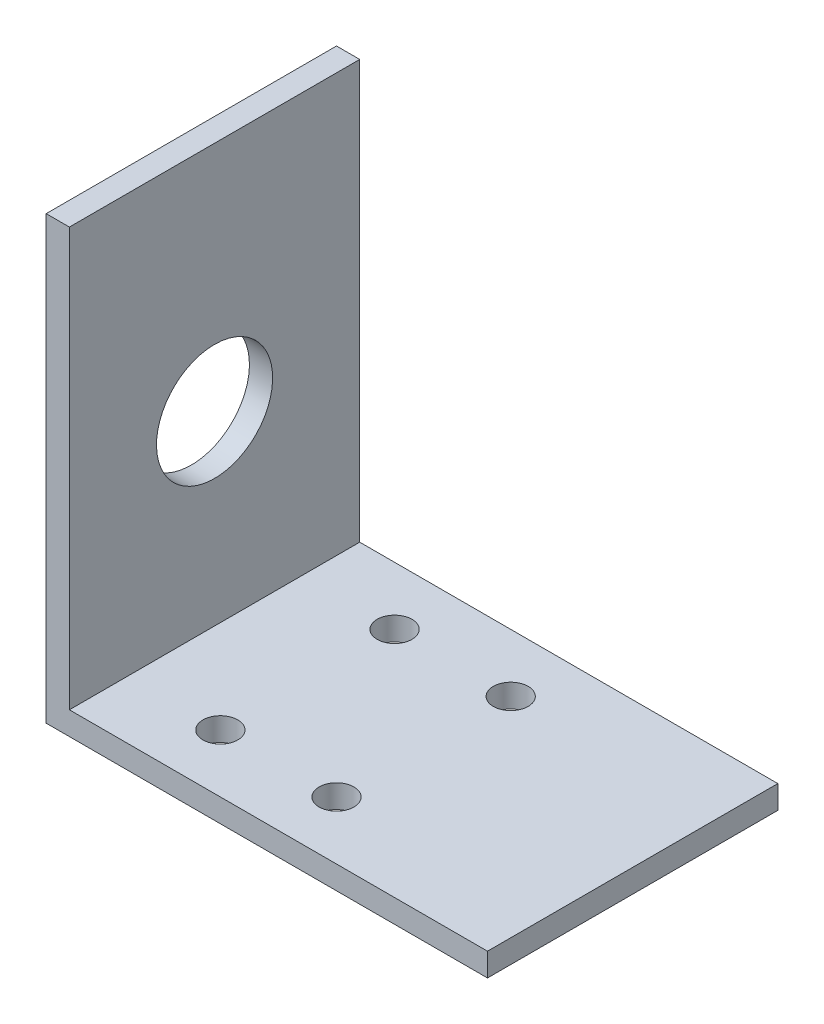
ISO-10303-21;
HEADER;
FILE_DESCRIPTION(('STEP AP214'),'2;1');
FILE_NAME('part.step','',(''),(''),'','','');
FILE_SCHEMA(('AUTOMOTIVE_DESIGN { 1 0 10303 214 1 1 1 1 }'));
ENDSEC;
DATA;
#1=APPLICATION_CONTEXT('core data for automotive mechanical design processes');
#2=APPLICATION_PROTOCOL_DEFINITION('international standard','automotive_design',2000,#1);
#3=PRODUCT_CONTEXT('',#1,'mechanical');
#4=PRODUCT('Part','Part','',(#3));
#5=PRODUCT_RELATED_PRODUCT_CATEGORY('part','',(#4));
#6=PRODUCT_DEFINITION_FORMATION('','',#4);
#7=PRODUCT_DEFINITION_CONTEXT('part definition',#1,'design');
#8=PRODUCT_DEFINITION('design','',#6,#7);
#9=PRODUCT_DEFINITION_SHAPE('','',#8);
#10=(LENGTH_UNIT() NAMED_UNIT(*) SI_UNIT(.MILLI.,.METRE.));
#11=(NAMED_UNIT(*) PLANE_ANGLE_UNIT() SI_UNIT($,.RADIAN.));
#12=(NAMED_UNIT(*) SI_UNIT($,.STERADIAN.) SOLID_ANGLE_UNIT());
#13=UNCERTAINTY_MEASURE_WITH_UNIT(LENGTH_MEASURE(1.E-05),#10,'distance_accuracy_value','');
#14=(GEOMETRIC_REPRESENTATION_CONTEXT(3) GLOBAL_UNCERTAINTY_ASSIGNED_CONTEXT((#13)) GLOBAL_UNIT_ASSIGNED_CONTEXT((#10,
#11,#12)) REPRESENTATION_CONTEXT('',''));
#15=CARTESIAN_POINT('',(0.,0.,0.));
#16=DIRECTION('',(0.,0.,1.));
#17=DIRECTION('',(1.,0.,0.));
#18=AXIS2_PLACEMENT_3D('',#15,#16,#17);
#19=CARTESIAN_POINT('',(-9.52783601940228,18.6976034006155,25.));
#20=DIRECTION('',(0.,-1.,0.));
#21=DIRECTION('',(0.,0.,-1.));
#22=AXIS2_PLACEMENT_3D('',#19,#20,#21);
#23=PLANE('',#22);
#24=DIRECTION('',(-1.,0.,0.));
#25=VECTOR('',#24,1.);
#26=CARTESIAN_POINT('',(-9.52783601940228,18.6976034006155,0.));
#27=LINE('',#26,#25);
#28=CARTESIAN_POINT('',(-9.52783601940228,18.6976034006155,0.));
#29=VERTEX_POINT('',#28);
#30=CARTESIAN_POINT('',(-11.5278360194023,18.6976034006155,0.));
#31=VERTEX_POINT('',#30);
#32=EDGE_CURVE('E128',#29,#31,#27,.T.);
#33=ORIENTED_EDGE('',*,*,#32,.T.);
#34=DIRECTION('',(0.,0.,-1.));
#35=VECTOR('',#34,1.);
#36=CARTESIAN_POINT('',(-11.5278360194023,18.6976034006155,25.));
#37=LINE('',#36,#35);
#38=CARTESIAN_POINT('',(-11.5278360194023,18.6976034006155,25.));
#39=VERTEX_POINT('',#38);
#40=EDGE_CURVE('E11',#39,#31,#37,.T.);
#41=ORIENTED_EDGE('',*,*,#40,.F.);
#42=DIRECTION('',(-1.,0.,0.));
#43=VECTOR('',#42,1.);
#44=CARTESIAN_POINT('',(-9.52783601940228,18.6976034006155,25.));
#45=LINE('',#44,#43);
#46=CARTESIAN_POINT('',(-9.52783601940228,18.6976034006155,25.));
#47=VERTEX_POINT('',#46);
#48=EDGE_CURVE('E145',#47,#39,#45,.T.);
#49=ORIENTED_EDGE('',*,*,#48,.F.);
#50=DIRECTION('',(0.,0.,-1.));
#51=VECTOR('',#50,1.);
#52=CARTESIAN_POINT('',(-9.52783601940228,18.6976034006155,25.));
#53=LINE('',#52,#51);
#54=EDGE_CURVE('E124',#47,#29,#53,.T.);
#55=ORIENTED_EDGE('',*,*,#54,.T.);
#56=EDGE_LOOP('',(#33,#41,#49,#55));
#57=FACE_BOUND('',#56,.T.);
#58=ADVANCED_FACE('F39',(#57),#23,.F.);
#59=CARTESIAN_POINT('',(-11.5278360194023,18.6976034006155,25.));
#60=DIRECTION('',(1.,0.,0.));
#61=DIRECTION('',(0.,0.,-1.));
#62=AXIS2_PLACEMENT_3D('',#59,#60,#61);
#63=PLANE('',#62);
#64=CARTESIAN_POINT('',(-11.5278360194023,-1.30239659938455,12.5));
#65=DIRECTION('',(1.,0.,0.));
#66=DIRECTION('',(0.,1.,0.));
#67=AXIS2_PLACEMENT_3D('',#64,#65,#66);
#68=CIRCLE('',#67,5.);
#69=CARTESIAN_POINT('',(-11.5278360194023,3.69760340061546,12.5));
#70=VERTEX_POINT('',#69);
#71=EDGE_CURVE('E277',#70,#70,#68,.T.);
#72=ORIENTED_EDGE('',*,*,#71,.T.);
#73=EDGE_LOOP('',(#72));
#74=FACE_BOUND('',#73,.T.);
#75=DIRECTION('',(0.,-1.,0.));
#76=VECTOR('',#75,1.);
#77=CARTESIAN_POINT('',(-11.5278360194023,18.6976034006155,0.));
#78=LINE('',#77,#76);
#79=CARTESIAN_POINT('',(-11.5278360194023,-19.3023965993845,0.));
#80=VERTEX_POINT('',#79);
#81=EDGE_CURVE('E132',#31,#80,#78,.T.);
#82=ORIENTED_EDGE('',*,*,#81,.T.);
#83=DIRECTION('',(0.,0.,-1.));
#84=VECTOR('',#83,1.);
#85=CARTESIAN_POINT('',(-11.5278360194023,-19.3023965993845,25.));
#86=LINE('',#85,#84);
#87=CARTESIAN_POINT('',(-11.5278360194023,-19.3023965993845,25.));
#88=VERTEX_POINT('',#87);
#89=EDGE_CURVE('E48',#88,#80,#86,.T.);
#90=ORIENTED_EDGE('',*,*,#89,.F.);
#91=DIRECTION('',(0.,-1.,0.));
#92=VECTOR('',#91,1.);
#93=CARTESIAN_POINT('',(-11.5278360194023,18.6976034006155,25.));
#94=LINE('',#93,#92);
#95=EDGE_CURVE('E93',#39,#88,#94,.T.);
#96=ORIENTED_EDGE('',*,*,#95,.F.);
#97=ORIENTED_EDGE('',*,*,#40,.T.);
#98=EDGE_LOOP('',(#82,#90,#96,#97));
#99=FACE_BOUND('',#98,.T.);
#100=ADVANCED_FACE('F176',(#74,#99),#63,.F.);
#101=CARTESIAN_POINT('',(-11.5278360194023,-19.3023965993845,25.));
#102=DIRECTION('',(0.,1.,0.));
#103=DIRECTION('',(0.,0.,1.));
#104=AXIS2_PLACEMENT_3D('',#101,#102,#103);
#105=PLANE('',#104);
#106=CARTESIAN_POINT('',(8.47216398059772,-19.3023965993845,5.));
#107=DIRECTION('',(0.,1.,0.));
#108=DIRECTION('',(-1.,0.,0.));
#109=AXIS2_PLACEMENT_3D('',#106,#107,#108);
#110=CIRCLE('',#109,1.5);
#111=CARTESIAN_POINT('',(6.97216398059772,-19.3023965993845,5.));
#112=VERTEX_POINT('',#111);
#113=EDGE_CURVE('E286',#112,#112,#110,.T.);
#114=ORIENTED_EDGE('',*,*,#113,.T.);
#115=EDGE_LOOP('',(#114));
#116=FACE_BOUND('',#115,.T.);
#117=CARTESIAN_POINT('',(8.47216398059772,-19.3023965993845,20.));
#118=DIRECTION('',(0.,1.,0.));
#119=DIRECTION('',(-1.,0.,0.));
#120=AXIS2_PLACEMENT_3D('',#117,#118,#119);
#121=CIRCLE('',#120,1.5);
#122=CARTESIAN_POINT('',(6.97216398059772,-19.3023965993845,20.));
#123=VERTEX_POINT('',#122);
#124=EDGE_CURVE('E295',#123,#123,#121,.T.);
#125=ORIENTED_EDGE('',*,*,#124,.T.);
#126=EDGE_LOOP('',(#125));
#127=FACE_BOUND('',#126,.T.);
#128=CARTESIAN_POINT('',(-1.52783601940228,-19.3023965993845,20.));
#129=DIRECTION('',(0.,1.,0.));
#130=DIRECTION('',(-1.,0.,0.));
#131=AXIS2_PLACEMENT_3D('',#128,#129,#130);
#132=CIRCLE('',#131,1.5);
#133=CARTESIAN_POINT('',(-3.02783601940228,-19.3023965993845,20.));
#134=VERTEX_POINT('',#133);
#135=EDGE_CURVE('E303',#134,#134,#132,.T.);
#136=ORIENTED_EDGE('',*,*,#135,.T.);
#137=EDGE_LOOP('',(#136));
#138=FACE_BOUND('',#137,.T.);
#139=CARTESIAN_POINT('',(-1.52783601940228,-19.3023965993845,5.));
#140=DIRECTION('',(0.,1.,0.));
#141=DIRECTION('',(-1.,0.,0.));
#142=AXIS2_PLACEMENT_3D('',#139,#140,#141);
#143=CIRCLE('',#142,1.5);
#144=CARTESIAN_POINT('',(-3.02783601940228,-19.3023965993845,5.));
#145=VERTEX_POINT('',#144);
#146=EDGE_CURVE('E133',#145,#145,#143,.T.);
#147=ORIENTED_EDGE('',*,*,#146,.T.);
#148=EDGE_LOOP('',(#147));
#149=FACE_BOUND('',#148,.T.);
#150=DIRECTION('',(1.,0.,0.));
#151=VECTOR('',#150,1.);
#152=CARTESIAN_POINT('',(-11.5278360194023,-19.3023965993845,0.));
#153=LINE('',#152,#151);
#154=CARTESIAN_POINT('',(26.4721639805977,-19.3023965993845,0.));
#155=VERTEX_POINT('',#154);
#156=EDGE_CURVE('E136',#80,#155,#153,.T.);
#157=ORIENTED_EDGE('',*,*,#156,.T.);
#158=DIRECTION('',(0.,0.,-1.));
#159=VECTOR('',#158,1.);
#160=CARTESIAN_POINT('',(26.4721639805977,-19.3023965993845,25.));
#161=LINE('',#160,#159);
#162=CARTESIAN_POINT('',(26.4721639805977,-19.3023965993845,25.));
#163=VERTEX_POINT('',#162);
#164=EDGE_CURVE('E117',#163,#155,#161,.T.);
#165=ORIENTED_EDGE('',*,*,#164,.F.);
#166=DIRECTION('',(1.,0.,0.));
#167=VECTOR('',#166,1.);
#168=CARTESIAN_POINT('',(-11.5278360194023,-19.3023965993845,25.));
#169=LINE('',#168,#167);
#170=EDGE_CURVE('E106',#88,#163,#169,.T.);
#171=ORIENTED_EDGE('',*,*,#170,.F.);
#172=ORIENTED_EDGE('',*,*,#89,.T.);
#173=EDGE_LOOP('',(#157,#165,#171,#172));
#174=FACE_BOUND('',#173,.T.);
#175=ADVANCED_FACE('F155',(#116,#127,#138,#149,#174),#105,.F.);
#176=CARTESIAN_POINT('',(26.4721639805977,-19.3023965993845,25.));
#177=DIRECTION('',(-1.,0.,0.));
#178=DIRECTION('',(0.,0.,1.));
#179=AXIS2_PLACEMENT_3D('',#176,#177,#178);
#180=PLANE('',#179);
#181=DIRECTION('',(0.,1.,0.));
#182=VECTOR('',#181,1.);
#183=CARTESIAN_POINT('',(26.4721639805977,-19.3023965993845,0.));
#184=LINE('',#183,#182);
#185=CARTESIAN_POINT('',(26.4721639805977,-17.3023965993845,0.));
#186=VERTEX_POINT('',#185);
#187=EDGE_CURVE('E115',#155,#186,#184,.T.);
#188=ORIENTED_EDGE('',*,*,#187,.T.);
#189=DIRECTION('',(0.,0.,-1.));
#190=VECTOR('',#189,1.);
#191=CARTESIAN_POINT('',(26.4721639805977,-17.3023965993845,25.));
#192=LINE('',#191,#190);
#193=CARTESIAN_POINT('',(26.4721639805977,-17.3023965993845,25.));
#194=VERTEX_POINT('',#193);
#195=EDGE_CURVE('E112',#194,#186,#192,.T.);
#196=ORIENTED_EDGE('',*,*,#195,.F.);
#197=DIRECTION('',(0.,1.,0.));
#198=VECTOR('',#197,1.);
#199=CARTESIAN_POINT('',(26.4721639805977,-19.3023965993845,25.));
#200=LINE('',#199,#198);
#201=EDGE_CURVE('E100',#163,#194,#200,.T.);
#202=ORIENTED_EDGE('',*,*,#201,.F.);
#203=ORIENTED_EDGE('',*,*,#164,.T.);
#204=EDGE_LOOP('',(#188,#196,#202,#203));
#205=FACE_BOUND('',#204,.T.);
#206=ADVANCED_FACE('F113',(#205),#180,.F.);
#207=CARTESIAN_POINT('',(26.4721639805977,-17.3023965993845,25.));
#208=DIRECTION('',(0.,-1.,0.));
#209=DIRECTION('',(1.,0.,0.));
#210=AXIS2_PLACEMENT_3D('',#207,#208,#209);
#211=PLANE('',#210);
#212=CARTESIAN_POINT('',(8.47216398059772,-17.3023965993846,5.));
#213=DIRECTION('',(0.,1.,0.));
#214=DIRECTION('',(-1.,0.,0.));
#215=AXIS2_PLACEMENT_3D('',#212,#213,#214);
#216=CIRCLE('',#215,1.5);
#217=CARTESIAN_POINT('',(6.97216398059772,-17.3023965993846,5.));
#218=VERTEX_POINT('',#217);
#219=EDGE_CURVE('E291',#218,#218,#216,.T.);
#220=ORIENTED_EDGE('',*,*,#219,.F.);
#221=EDGE_LOOP('',(#220));
#222=FACE_BOUND('',#221,.T.);
#223=CARTESIAN_POINT('',(8.47216398059772,-17.3023965993846,20.));
#224=DIRECTION('',(0.,1.,0.));
#225=DIRECTION('',(-1.,0.,0.));
#226=AXIS2_PLACEMENT_3D('',#223,#224,#225);
#227=CIRCLE('',#226,1.5);
#228=CARTESIAN_POINT('',(6.97216398059772,-17.3023965993846,20.));
#229=VERTEX_POINT('',#228);
#230=EDGE_CURVE('E299',#229,#229,#227,.T.);
#231=ORIENTED_EDGE('',*,*,#230,.F.);
#232=EDGE_LOOP('',(#231));
#233=FACE_BOUND('',#232,.T.);
#234=CARTESIAN_POINT('',(-1.52783601940228,-17.3023965993846,20.));
#235=DIRECTION('',(0.,1.,0.));
#236=DIRECTION('',(-1.,0.,0.));
#237=AXIS2_PLACEMENT_3D('',#234,#235,#236);
#238=CIRCLE('',#237,1.5);
#239=CARTESIAN_POINT('',(-3.02783601940228,-17.3023965993846,20.));
#240=VERTEX_POINT('',#239);
#241=EDGE_CURVE('E283',#240,#240,#238,.T.);
#242=ORIENTED_EDGE('',*,*,#241,.F.);
#243=EDGE_LOOP('',(#242));
#244=FACE_BOUND('',#243,.T.);
#245=CARTESIAN_POINT('',(-1.52783601940228,-17.3023965993846,5.));
#246=DIRECTION('',(0.,1.,0.));
#247=DIRECTION('',(-1.,0.,0.));
#248=AXIS2_PLACEMENT_3D('',#245,#246,#247);
#249=CIRCLE('',#248,1.5);
#250=CARTESIAN_POINT('',(-3.02783601940228,-17.3023965993846,5.));
#251=VERTEX_POINT('',#250);
#252=EDGE_CURVE('E290',#251,#251,#249,.T.);
#253=ORIENTED_EDGE('',*,*,#252,.F.);
#254=EDGE_LOOP('',(#253));
#255=FACE_BOUND('',#254,.T.);
#256=DIRECTION('',(-1.,0.,0.));
#257=VECTOR('',#256,1.);
#258=CARTESIAN_POINT('',(26.4721639805977,-17.3023965993845,0.));
#259=LINE('',#258,#257);
#260=CARTESIAN_POINT('',(-9.52783601940228,-17.3023965993846,0.));
#261=VERTEX_POINT('',#260);
#262=EDGE_CURVE('E79',#186,#261,#259,.T.);
#263=ORIENTED_EDGE('',*,*,#262,.T.);
#264=DIRECTION('',(0.,0.,-1.));
#265=VECTOR('',#264,1.);
#266=CARTESIAN_POINT('',(-9.52783601940228,-17.3023965993846,25.));
#267=LINE('',#266,#265);
#268=CARTESIAN_POINT('',(-9.52783601940228,-17.3023965993846,25.));
#269=VERTEX_POINT('',#268);
#270=EDGE_CURVE('E118',#269,#261,#267,.T.);
#271=ORIENTED_EDGE('',*,*,#270,.F.);
#272=DIRECTION('',(-1.,0.,0.));
#273=VECTOR('',#272,1.);
#274=CARTESIAN_POINT('',(26.4721639805977,-17.3023965993845,25.));
#275=LINE('',#274,#273);
#276=EDGE_CURVE('E104',#194,#269,#275,.T.);
#277=ORIENTED_EDGE('',*,*,#276,.F.);
#278=ORIENTED_EDGE('',*,*,#195,.T.);
#279=EDGE_LOOP('',(#263,#271,#277,#278));
#280=FACE_BOUND('',#279,.T.);
#281=ADVANCED_FACE('F120',(#222,#233,#244,#255,#280),#211,.F.);
#282=CARTESIAN_POINT('',(-9.52783601940228,-17.3023965993846,25.));
#283=DIRECTION('',(-1.,0.,0.));
#284=DIRECTION('',(0.,-1.,0.));
#285=AXIS2_PLACEMENT_3D('',#282,#283,#284);
#286=PLANE('',#285);
#287=CARTESIAN_POINT('',(-9.52783601940228,-1.30239659938455,12.5));
#288=DIRECTION('',(1.,0.,0.));
#289=DIRECTION('',(0.,1.,0.));
#290=AXIS2_PLACEMENT_3D('',#287,#288,#289);
#291=CIRCLE('',#290,5.);
#292=CARTESIAN_POINT('',(-9.52783601940228,3.69760340061546,12.5));
#293=VERTEX_POINT('',#292);
#294=EDGE_CURVE('E279',#293,#293,#291,.T.);
#295=ORIENTED_EDGE('',*,*,#294,.F.);
#296=EDGE_LOOP('',(#295));
#297=FACE_BOUND('',#296,.T.);
#298=DIRECTION('',(0.,1.,0.));
#299=VECTOR('',#298,1.);
#300=CARTESIAN_POINT('',(-9.52783601940228,-17.3023965993846,0.));
#301=LINE('',#300,#299);
#302=EDGE_CURVE('E85',#261,#29,#301,.T.);
#303=ORIENTED_EDGE('',*,*,#302,.T.);
#304=ORIENTED_EDGE('',*,*,#54,.F.);
#305=DIRECTION('',(0.,1.,0.));
#306=VECTOR('',#305,1.);
#307=CARTESIAN_POINT('',(-9.52783601940228,-17.3023965993846,25.));
#308=LINE('',#307,#306);
#309=EDGE_CURVE('E56',#269,#47,#308,.T.);
#310=ORIENTED_EDGE('',*,*,#309,.F.);
#311=ORIENTED_EDGE('',*,*,#270,.T.);
#312=EDGE_LOOP('',(#303,#304,#310,#311));
#313=FACE_BOUND('',#312,.T.);
#314=ADVANCED_FACE('F162',(#297,#313),#286,.F.);
#315=CARTESIAN_POINT('',(0.,0.,25.));
#316=DIRECTION('',(0.,0.,1.));
#317=DIRECTION('',(1.,0.,0.));
#318=AXIS2_PLACEMENT_3D('',#315,#316,#317);
#319=PLANE('',#318);
#320=ORIENTED_EDGE('',*,*,#48,.T.);
#321=ORIENTED_EDGE('',*,*,#95,.T.);
#322=ORIENTED_EDGE('',*,*,#170,.T.);
#323=ORIENTED_EDGE('',*,*,#201,.T.);
#324=ORIENTED_EDGE('',*,*,#276,.T.);
#325=ORIENTED_EDGE('',*,*,#309,.T.);
#326=EDGE_LOOP('',(#320,#321,#322,#323,#324,#325));
#327=FACE_BOUND('',#326,.T.);
#328=ADVANCED_FACE('F102',(#327),#319,.T.);
#329=CARTESIAN_POINT('',(0.,0.,0.));
#330=DIRECTION('',(0.,0.,1.));
#331=DIRECTION('',(1.,0.,0.));
#332=AXIS2_PLACEMENT_3D('',#329,#330,#331);
#333=PLANE('',#332);
#334=ORIENTED_EDGE('',*,*,#32,.F.);
#335=ORIENTED_EDGE('',*,*,#302,.F.);
#336=ORIENTED_EDGE('',*,*,#262,.F.);
#337=ORIENTED_EDGE('',*,*,#187,.F.);
#338=ORIENTED_EDGE('',*,*,#156,.F.);
#339=ORIENTED_EDGE('',*,*,#81,.F.);
#340=EDGE_LOOP('',(#334,#335,#336,#337,#338,#339));
#341=FACE_BOUND('',#340,.T.);
#342=ADVANCED_FACE('F158',(#341),#333,.F.);
#343=CARTESIAN_POINT('',(-1.52783601940228,-19.3023965993845,5.));
#344=DIRECTION('',(0.,1.,0.));
#345=DIRECTION('',(-1.,0.,0.));
#346=AXIS2_PLACEMENT_3D('',#343,#344,#345);
#347=CYLINDRICAL_SURFACE('',#346,1.5);
#348=ORIENTED_EDGE('',*,*,#146,.F.);
#349=EDGE_LOOP('',(#348));
#350=FACE_BOUND('',#349,.T.);
#351=ORIENTED_EDGE('',*,*,#252,.T.);
#352=EDGE_LOOP('',(#351));
#353=FACE_BOUND('',#352,.T.);
#354=ADVANCED_FACE('F207',(#350,#353),#347,.F.);
#355=CARTESIAN_POINT('',(-1.52783601940228,-19.3023965993845,20.));
#356=DIRECTION('',(0.,1.,0.));
#357=DIRECTION('',(-1.,0.,0.));
#358=AXIS2_PLACEMENT_3D('',#355,#356,#357);
#359=CYLINDRICAL_SURFACE('',#358,1.5);
#360=ORIENTED_EDGE('',*,*,#135,.F.);
#361=EDGE_LOOP('',(#360));
#362=FACE_BOUND('',#361,.T.);
#363=ORIENTED_EDGE('',*,*,#241,.T.);
#364=EDGE_LOOP('',(#363));
#365=FACE_BOUND('',#364,.T.);
#366=ADVANCED_FACE('F212',(#362,#365),#359,.F.);
#367=CARTESIAN_POINT('',(8.47216398059772,-19.3023965993845,20.));
#368=DIRECTION('',(0.,1.,0.));
#369=DIRECTION('',(-1.,0.,0.));
#370=AXIS2_PLACEMENT_3D('',#367,#368,#369);
#371=CYLINDRICAL_SURFACE('',#370,1.5);
#372=ORIENTED_EDGE('',*,*,#124,.F.);
#373=EDGE_LOOP('',(#372));
#374=FACE_BOUND('',#373,.T.);
#375=ORIENTED_EDGE('',*,*,#230,.T.);
#376=EDGE_LOOP('',(#375));
#377=FACE_BOUND('',#376,.T.);
#378=ADVANCED_FACE('F224',(#374,#377),#371,.F.);
#379=CARTESIAN_POINT('',(8.47216398059772,-19.3023965993845,5.));
#380=DIRECTION('',(0.,1.,0.));
#381=DIRECTION('',(-1.,0.,0.));
#382=AXIS2_PLACEMENT_3D('',#379,#380,#381);
#383=CYLINDRICAL_SURFACE('',#382,1.5);
#384=ORIENTED_EDGE('',*,*,#113,.F.);
#385=EDGE_LOOP('',(#384));
#386=FACE_BOUND('',#385,.T.);
#387=ORIENTED_EDGE('',*,*,#219,.T.);
#388=EDGE_LOOP('',(#387));
#389=FACE_BOUND('',#388,.T.);
#390=ADVANCED_FACE('F234',(#386,#389),#383,.F.);
#391=CARTESIAN_POINT('',(-11.5278360194023,-1.30239659938455,12.5));
#392=DIRECTION('',(1.,0.,0.));
#393=DIRECTION('',(0.,1.,0.));
#394=AXIS2_PLACEMENT_3D('',#391,#392,#393);
#395=CYLINDRICAL_SURFACE('',#394,5.);
#396=ORIENTED_EDGE('',*,*,#71,.F.);
#397=EDGE_LOOP('',(#396));
#398=FACE_BOUND('',#397,.T.);
#399=ORIENTED_EDGE('',*,*,#294,.T.);
#400=EDGE_LOOP('',(#399));
#401=FACE_BOUND('',#400,.T.);
#402=ADVANCED_FACE('F243',(#398,#401),#395,.F.);
#403=CLOSED_SHELL('',(#58,#100,#175,#206,#281,#314,#328,#342,#354,#366,#378,#390,#402));
#404=MANIFOLD_SOLID_BREP('B2',#403);
#405=ADVANCED_BREP_SHAPE_REPRESENTATION('',(#18,#404),#14);
#406=SHAPE_DEFINITION_REPRESENTATION(#9,#405);
ENDSEC;
END-ISO-10303-21;
